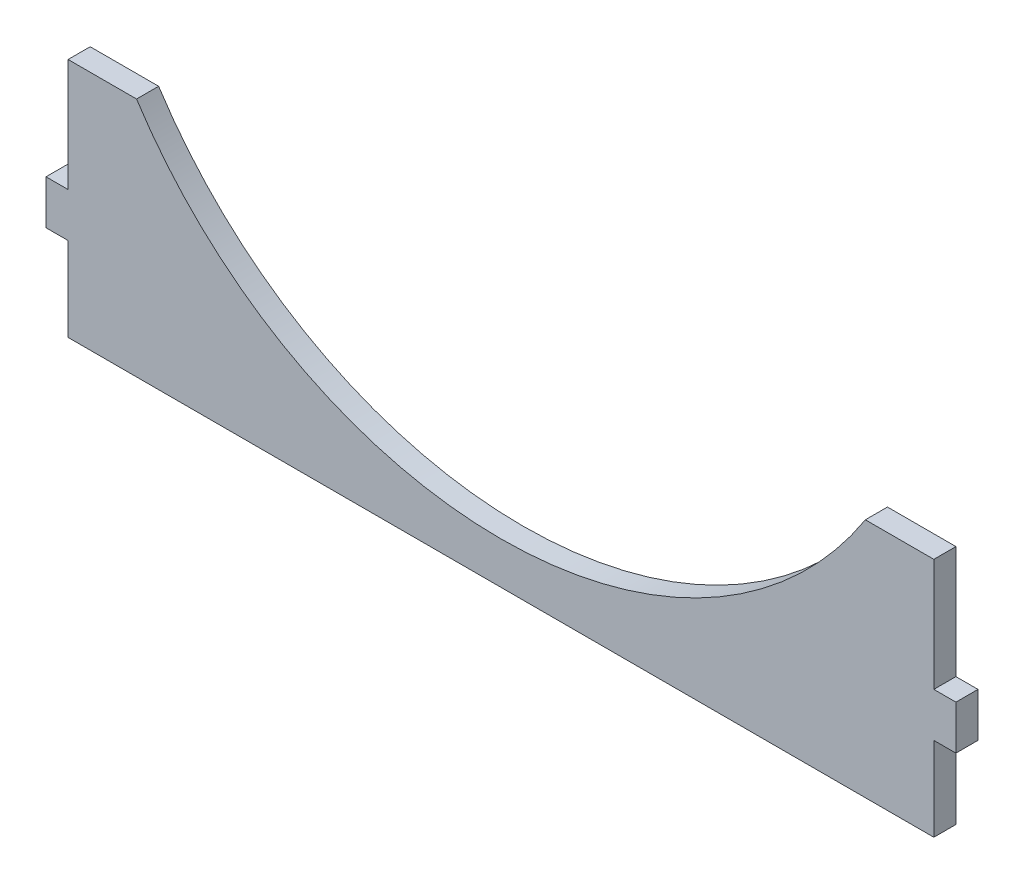
ISO-10303-21;
HEADER;
FILE_DESCRIPTION(('STEP AP214'),'2;1');
FILE_NAME('part.step','',(''),(''),'','','');
FILE_SCHEMA(('AUTOMOTIVE_DESIGN { 1 0 10303 214 1 1 1 1 }'));
ENDSEC;
DATA;
#1=APPLICATION_CONTEXT('core data for automotive mechanical design processes');
#2=APPLICATION_PROTOCOL_DEFINITION('international standard','automotive_design',2000,#1);
#3=PRODUCT_CONTEXT('',#1,'mechanical');
#4=PRODUCT('Part','Part','',(#3));
#5=PRODUCT_RELATED_PRODUCT_CATEGORY('part','',(#4));
#6=PRODUCT_DEFINITION_FORMATION('','',#4);
#7=PRODUCT_DEFINITION_CONTEXT('part definition',#1,'design');
#8=PRODUCT_DEFINITION('design','',#6,#7);
#9=PRODUCT_DEFINITION_SHAPE('','',#8);
#10=(LENGTH_UNIT() NAMED_UNIT(*) SI_UNIT(.MILLI.,.METRE.));
#11=(NAMED_UNIT(*) PLANE_ANGLE_UNIT() SI_UNIT($,.RADIAN.));
#12=(NAMED_UNIT(*) SI_UNIT($,.STERADIAN.) SOLID_ANGLE_UNIT());
#13=UNCERTAINTY_MEASURE_WITH_UNIT(LENGTH_MEASURE(1.E-05),#10,'distance_accuracy_value','');
#14=(GEOMETRIC_REPRESENTATION_CONTEXT(3) GLOBAL_UNCERTAINTY_ASSIGNED_CONTEXT((#13)) GLOBAL_UNIT_ASSIGNED_CONTEXT((#10,
#11,#12)) REPRESENTATION_CONTEXT('',''));
#15=CARTESIAN_POINT('',(0.,0.,0.));
#16=DIRECTION('',(0.,0.,1.));
#17=DIRECTION('',(1.,0.,0.));
#18=AXIS2_PLACEMENT_3D('',#15,#16,#17);
#19=CARTESIAN_POINT('',(82.5,53.125,5.));
#20=DIRECTION('',(0.,0.,-1.));
#21=DIRECTION('',(-1.,0.,0.));
#22=AXIS2_PLACEMENT_3D('',#19,#20,#21);
#23=CYLINDRICAL_SURFACE('',#22,98.125);
#24=CARTESIAN_POINT('',(82.5,53.125,0.));
#25=DIRECTION('',(0.,0.,-1.));
#26=DIRECTION('',(-1.,0.,0.));
#27=AXIS2_PLACEMENT_3D('',#24,#25,#26);
#28=CIRCLE('',#27,98.125);
#29=CARTESIAN_POINT('',(165.,0.,0.));
#30=VERTEX_POINT('',#29);
#31=CARTESIAN_POINT('',(0.,0.,0.));
#32=VERTEX_POINT('',#31);
#33=EDGE_CURVE('E177',#30,#32,#28,.T.);
#34=ORIENTED_EDGE('',*,*,#33,.T.);
#35=DIRECTION('',(0.,0.,-1.));
#36=VECTOR('',#35,1.);
#37=CARTESIAN_POINT('',(0.,0.,5.));
#38=LINE('',#37,#36);
#39=CARTESIAN_POINT('',(0.,0.,5.));
#40=VERTEX_POINT('',#39);
#41=EDGE_CURVE('E11',#40,#32,#38,.T.);
#42=ORIENTED_EDGE('',*,*,#41,.F.);
#43=CARTESIAN_POINT('',(82.5,53.125,5.));
#44=DIRECTION('',(0.,0.,-1.));
#45=DIRECTION('',(-1.,0.,0.));
#46=AXIS2_PLACEMENT_3D('',#43,#44,#45);
#47=CIRCLE('',#46,98.125);
#48=CARTESIAN_POINT('',(165.,0.,5.));
#49=VERTEX_POINT('',#48);
#50=EDGE_CURVE('E217',#49,#40,#47,.T.);
#51=ORIENTED_EDGE('',*,*,#50,.F.);
#52=DIRECTION('',(0.,0.,-1.));
#53=VECTOR('',#52,1.);
#54=CARTESIAN_POINT('',(165.,0.,5.));
#55=LINE('',#54,#53);
#56=EDGE_CURVE('E173',#49,#30,#55,.T.);
#57=ORIENTED_EDGE('',*,*,#56,.T.);
#58=EDGE_LOOP('',(#34,#42,#51,#57));
#59=FACE_BOUND('',#58,.T.);
#60=ADVANCED_FACE('F39',(#59),#23,.F.);
#61=CARTESIAN_POINT('',(0.,0.,5.));
#62=DIRECTION('',(0.,-1.,0.));
#63=DIRECTION('',(0.,0.,-1.));
#64=AXIS2_PLACEMENT_3D('',#61,#62,#63);
#65=PLANE('',#64);
#66=DIRECTION('',(-1.,0.,0.));
#67=VECTOR('',#66,1.);
#68=CARTESIAN_POINT('',(0.,0.,0.));
#69=LINE('',#68,#67);
#70=CARTESIAN_POINT('',(-15.5,0.,0.));
#71=VERTEX_POINT('',#70);
#72=EDGE_CURVE('E181',#32,#71,#69,.T.);
#73=ORIENTED_EDGE('',*,*,#72,.T.);
#74=DIRECTION('',(0.,0.,-1.));
#75=VECTOR('',#74,1.);
#76=CARTESIAN_POINT('',(-15.5,0.,5.));
#77=LINE('',#76,#75);
#78=CARTESIAN_POINT('',(-15.5,0.,5.));
#79=VERTEX_POINT('',#78);
#80=EDGE_CURVE('E48',#79,#71,#77,.T.);
#81=ORIENTED_EDGE('',*,*,#80,.F.);
#82=DIRECTION('',(-1.,0.,0.));
#83=VECTOR('',#82,1.);
#84=CARTESIAN_POINT('',(0.,0.,5.));
#85=LINE('',#84,#83);
#86=EDGE_CURVE('E117',#40,#79,#85,.T.);
#87=ORIENTED_EDGE('',*,*,#86,.F.);
#88=ORIENTED_EDGE('',*,*,#41,.T.);
#89=EDGE_LOOP('',(#73,#81,#87,#88));
#90=FACE_BOUND('',#89,.T.);
#91=ADVANCED_FACE('F361',(#90),#65,.F.);
#92=CARTESIAN_POINT('',(-15.5,0.,5.));
#93=DIRECTION('',(1.,0.,0.));
#94=DIRECTION('',(0.,1.,0.));
#95=AXIS2_PLACEMENT_3D('',#92,#93,#94);
#96=PLANE('',#95);
#97=DIRECTION('',(0.,-1.,0.));
#98=VECTOR('',#97,1.);
#99=CARTESIAN_POINT('',(-15.5,0.,0.));
#100=LINE('',#99,#98);
#101=CARTESIAN_POINT('',(-15.5,-25.5,0.));
#102=VERTEX_POINT('',#101);
#103=EDGE_CURVE('E184',#71,#102,#100,.T.);
#104=ORIENTED_EDGE('',*,*,#103,.T.);
#105=DIRECTION('',(0.,0.,-1.));
#106=VECTOR('',#105,1.);
#107=CARTESIAN_POINT('',(-15.5,-25.5,5.));
#108=LINE('',#107,#106);
#109=CARTESIAN_POINT('',(-15.5,-25.5,5.));
#110=VERTEX_POINT('',#109);
#111=EDGE_CURVE('E252',#110,#102,#108,.T.);
#112=ORIENTED_EDGE('',*,*,#111,.F.);
#113=DIRECTION('',(0.,-1.,0.));
#114=VECTOR('',#113,1.);
#115=CARTESIAN_POINT('',(-15.5,0.,5.));
#116=LINE('',#115,#114);
#117=EDGE_CURVE('E263',#79,#110,#116,.T.);
#118=ORIENTED_EDGE('',*,*,#117,.F.);
#119=ORIENTED_EDGE('',*,*,#80,.T.);
#120=EDGE_LOOP('',(#104,#112,#118,#119));
#121=FACE_BOUND('',#120,.T.);
#122=ADVANCED_FACE('F261',(#121),#96,.F.);
#123=CARTESIAN_POINT('',(-15.5,-25.5,5.));
#124=DIRECTION('',(0.,-1.,0.));
#125=DIRECTION('',(0.,0.,-1.));
#126=AXIS2_PLACEMENT_3D('',#123,#124,#125);
#127=PLANE('',#126);
#128=DIRECTION('',(-1.,0.,0.));
#129=VECTOR('',#128,1.);
#130=CARTESIAN_POINT('',(-15.5,-25.5,0.));
#131=LINE('',#130,#129);
#132=CARTESIAN_POINT('',(-20.5,-25.5,0.));
#133=VERTEX_POINT('',#132);
#134=EDGE_CURVE('E187',#102,#133,#131,.T.);
#135=ORIENTED_EDGE('',*,*,#134,.T.);
#136=DIRECTION('',(0.,0.,-1.));
#137=VECTOR('',#136,1.);
#138=CARTESIAN_POINT('',(-20.5,-25.5,5.));
#139=LINE('',#138,#137);
#140=CARTESIAN_POINT('',(-20.5,-25.5,5.));
#141=VERTEX_POINT('',#140);
#142=EDGE_CURVE('E248',#141,#133,#139,.T.);
#143=ORIENTED_EDGE('',*,*,#142,.F.);
#144=DIRECTION('',(-1.,0.,0.));
#145=VECTOR('',#144,1.);
#146=CARTESIAN_POINT('',(-15.5,-25.5,5.));
#147=LINE('',#146,#145);
#148=EDGE_CURVE('E282',#110,#141,#147,.T.);
#149=ORIENTED_EDGE('',*,*,#148,.F.);
#150=ORIENTED_EDGE('',*,*,#111,.T.);
#151=EDGE_LOOP('',(#135,#143,#149,#150));
#152=FACE_BOUND('',#151,.T.);
#153=ADVANCED_FACE('F272',(#152),#127,.F.);
#154=CARTESIAN_POINT('',(-20.5,-25.5,5.));
#155=DIRECTION('',(1.,0.,0.));
#156=DIRECTION('',(0.,1.,0.));
#157=AXIS2_PLACEMENT_3D('',#154,#155,#156);
#158=PLANE('',#157);
#159=DIRECTION('',(0.,-1.,0.));
#160=VECTOR('',#159,1.);
#161=CARTESIAN_POINT('',(-20.5,-25.5,0.));
#162=LINE('',#161,#160);
#163=CARTESIAN_POINT('',(-20.5,-35.5,0.));
#164=VERTEX_POINT('',#163);
#165=EDGE_CURVE('E190',#133,#164,#162,.T.);
#166=ORIENTED_EDGE('',*,*,#165,.T.);
#167=DIRECTION('',(0.,0.,-1.));
#168=VECTOR('',#167,1.);
#169=CARTESIAN_POINT('',(-20.5,-35.5,5.));
#170=LINE('',#169,#168);
#171=CARTESIAN_POINT('',(-20.5,-35.5,5.));
#172=VERTEX_POINT('',#171);
#173=EDGE_CURVE('E244',#172,#164,#170,.T.);
#174=ORIENTED_EDGE('',*,*,#173,.F.);
#175=DIRECTION('',(0.,-1.,0.));
#176=VECTOR('',#175,1.);
#177=CARTESIAN_POINT('',(-20.5,-25.5,5.));
#178=LINE('',#177,#176);
#179=EDGE_CURVE('E278',#141,#172,#178,.T.);
#180=ORIENTED_EDGE('',*,*,#179,.F.);
#181=ORIENTED_EDGE('',*,*,#142,.T.);
#182=EDGE_LOOP('',(#166,#174,#180,#181));
#183=FACE_BOUND('',#182,.T.);
#184=ADVANCED_FACE('F276',(#183),#158,.F.);
#185=CARTESIAN_POINT('',(-20.5,-35.5,5.));
#186=DIRECTION('',(0.,1.,0.));
#187=DIRECTION('',(0.,0.,1.));
#188=AXIS2_PLACEMENT_3D('',#185,#186,#187);
#189=PLANE('',#188);
#190=DIRECTION('',(1.,0.,0.));
#191=VECTOR('',#190,1.);
#192=CARTESIAN_POINT('',(-20.5,-35.5,0.));
#193=LINE('',#192,#191);
#194=CARTESIAN_POINT('',(-15.5,-35.5,0.));
#195=VERTEX_POINT('',#194);
#196=EDGE_CURVE('E193',#164,#195,#193,.T.);
#197=ORIENTED_EDGE('',*,*,#196,.T.);
#198=DIRECTION('',(0.,0.,-1.));
#199=VECTOR('',#198,1.);
#200=CARTESIAN_POINT('',(-15.5,-35.5,5.));
#201=LINE('',#200,#199);
#202=CARTESIAN_POINT('',(-15.5,-35.5,5.));
#203=VERTEX_POINT('',#202);
#204=EDGE_CURVE('E240',#203,#195,#201,.T.);
#205=ORIENTED_EDGE('',*,*,#204,.F.);
#206=DIRECTION('',(1.,0.,0.));
#207=VECTOR('',#206,1.);
#208=CARTESIAN_POINT('',(-20.5,-35.5,5.));
#209=LINE('',#208,#207);
#210=EDGE_CURVE('E281',#172,#203,#209,.T.);
#211=ORIENTED_EDGE('',*,*,#210,.F.);
#212=ORIENTED_EDGE('',*,*,#173,.T.);
#213=EDGE_LOOP('',(#197,#205,#211,#212));
#214=FACE_BOUND('',#213,.T.);
#215=ADVANCED_FACE('F373',(#214),#189,.F.);
#216=CARTESIAN_POINT('',(-15.5,-35.5,5.));
#217=DIRECTION('',(1.,0.,0.));
#218=DIRECTION('',(0.,1.,0.));
#219=AXIS2_PLACEMENT_3D('',#216,#217,#218);
#220=PLANE('',#219);
#221=DIRECTION('',(0.,-1.,0.));
#222=VECTOR('',#221,1.);
#223=CARTESIAN_POINT('',(-15.5,-35.5,0.));
#224=LINE('',#223,#222);
#225=CARTESIAN_POINT('',(-15.5,-54.5,0.));
#226=VERTEX_POINT('',#225);
#227=EDGE_CURVE('E196',#195,#226,#224,.T.);
#228=ORIENTED_EDGE('',*,*,#227,.T.);
#229=DIRECTION('',(0.,0.,-1.));
#230=VECTOR('',#229,1.);
#231=CARTESIAN_POINT('',(-15.5,-54.5,5.));
#232=LINE('',#231,#230);
#233=CARTESIAN_POINT('',(-15.5,-54.5,5.));
#234=VERTEX_POINT('',#233);
#235=EDGE_CURVE('E236',#234,#226,#232,.T.);
#236=ORIENTED_EDGE('',*,*,#235,.F.);
#237=DIRECTION('',(0.,-1.,0.));
#238=VECTOR('',#237,1.);
#239=CARTESIAN_POINT('',(-15.5,-35.5,5.));
#240=LINE('',#239,#238);
#241=EDGE_CURVE('E287',#203,#234,#240,.T.);
#242=ORIENTED_EDGE('',*,*,#241,.F.);
#243=ORIENTED_EDGE('',*,*,#204,.T.);
#244=EDGE_LOOP('',(#228,#236,#242,#243));
#245=FACE_BOUND('',#244,.T.);
#246=ADVANCED_FACE('F376',(#245),#220,.F.);
#247=CARTESIAN_POINT('',(-15.5,-54.5,5.));
#248=DIRECTION('',(0.,1.,0.));
#249=DIRECTION('',(-1.,0.,0.));
#250=AXIS2_PLACEMENT_3D('',#247,#248,#249);
#251=PLANE('',#250);
#252=DIRECTION('',(1.,0.,0.));
#253=VECTOR('',#252,1.);
#254=CARTESIAN_POINT('',(-15.5,-54.5,0.));
#255=LINE('',#254,#253);
#256=CARTESIAN_POINT('',(180.5,-54.4999999999999,0.));
#257=VERTEX_POINT('',#256);
#258=EDGE_CURVE('E199',#226,#257,#255,.T.);
#259=ORIENTED_EDGE('',*,*,#258,.T.);
#260=DIRECTION('',(0.,0.,-1.));
#261=VECTOR('',#260,1.);
#262=CARTESIAN_POINT('',(180.5,-54.4999999999999,5.));
#263=LINE('',#262,#261);
#264=CARTESIAN_POINT('',(180.5,-54.4999999999999,5.));
#265=VERTEX_POINT('',#264);
#266=EDGE_CURVE('E232',#265,#257,#263,.T.);
#267=ORIENTED_EDGE('',*,*,#266,.F.);
#268=DIRECTION('',(1.,0.,0.));
#269=VECTOR('',#268,1.);
#270=CARTESIAN_POINT('',(-15.5,-54.5,5.));
#271=LINE('',#270,#269);
#272=EDGE_CURVE('E294',#234,#265,#271,.T.);
#273=ORIENTED_EDGE('',*,*,#272,.F.);
#274=ORIENTED_EDGE('',*,*,#235,.T.);
#275=EDGE_LOOP('',(#259,#267,#273,#274));
#276=FACE_BOUND('',#275,.T.);
#277=ADVANCED_FACE('F380',(#276),#251,.F.);
#278=CARTESIAN_POINT('',(180.5,-54.4999999999999,5.));
#279=DIRECTION('',(-1.,0.,0.));
#280=DIRECTION('',(0.,-1.,0.));
#281=AXIS2_PLACEMENT_3D('',#278,#279,#280);
#282=PLANE('',#281);
#283=DIRECTION('',(0.,1.,0.));
#284=VECTOR('',#283,1.);
#285=CARTESIAN_POINT('',(180.5,-54.4999999999999,0.));
#286=LINE('',#285,#284);
#287=CARTESIAN_POINT('',(180.5,-35.4999999999999,0.));
#288=VERTEX_POINT('',#287);
#289=EDGE_CURVE('E202',#257,#288,#286,.T.);
#290=ORIENTED_EDGE('',*,*,#289,.T.);
#291=DIRECTION('',(0.,0.,-1.));
#292=VECTOR('',#291,1.);
#293=CARTESIAN_POINT('',(180.5,-35.4999999999999,5.));
#294=LINE('',#293,#292);
#295=CARTESIAN_POINT('',(180.5,-35.4999999999999,5.));
#296=VERTEX_POINT('',#295);
#297=EDGE_CURVE('E228',#296,#288,#294,.T.);
#298=ORIENTED_EDGE('',*,*,#297,.F.);
#299=DIRECTION('',(0.,1.,0.));
#300=VECTOR('',#299,1.);
#301=CARTESIAN_POINT('',(180.5,-54.4999999999999,5.));
#302=LINE('',#301,#300);
#303=EDGE_CURVE('E297',#265,#296,#302,.T.);
#304=ORIENTED_EDGE('',*,*,#303,.F.);
#305=ORIENTED_EDGE('',*,*,#266,.T.);
#306=EDGE_LOOP('',(#290,#298,#304,#305));
#307=FACE_BOUND('',#306,.T.);
#308=ADVANCED_FACE('F384',(#307),#282,.F.);
#309=CARTESIAN_POINT('',(180.5,-35.4999999999999,5.));
#310=DIRECTION('',(0.,1.,0.));
#311=DIRECTION('',(0.,0.,1.));
#312=AXIS2_PLACEMENT_3D('',#309,#310,#311);
#313=PLANE('',#312);
#314=DIRECTION('',(1.,0.,0.));
#315=VECTOR('',#314,1.);
#316=CARTESIAN_POINT('',(180.5,-35.4999999999999,0.));
#317=LINE('',#316,#315);
#318=CARTESIAN_POINT('',(185.5,-35.4999999999999,0.));
#319=VERTEX_POINT('',#318);
#320=EDGE_CURVE('E205',#288,#319,#317,.T.);
#321=ORIENTED_EDGE('',*,*,#320,.T.);
#322=DIRECTION('',(0.,0.,-1.));
#323=VECTOR('',#322,1.);
#324=CARTESIAN_POINT('',(185.5,-35.4999999999999,5.));
#325=LINE('',#324,#323);
#326=CARTESIAN_POINT('',(185.5,-35.4999999999999,5.));
#327=VERTEX_POINT('',#326);
#328=EDGE_CURVE('E224',#327,#319,#325,.T.);
#329=ORIENTED_EDGE('',*,*,#328,.F.);
#330=DIRECTION('',(1.,0.,0.));
#331=VECTOR('',#330,1.);
#332=CARTESIAN_POINT('',(180.5,-35.4999999999999,5.));
#333=LINE('',#332,#331);
#334=EDGE_CURVE('E300',#296,#327,#333,.T.);
#335=ORIENTED_EDGE('',*,*,#334,.F.);
#336=ORIENTED_EDGE('',*,*,#297,.T.);
#337=EDGE_LOOP('',(#321,#329,#335,#336));
#338=FACE_BOUND('',#337,.T.);
#339=ADVANCED_FACE('F388',(#338),#313,.F.);
#340=CARTESIAN_POINT('',(185.5,-35.4999999999999,5.));
#341=DIRECTION('',(-1.,0.,0.));
#342=DIRECTION('',(0.,0.,1.));
#343=AXIS2_PLACEMENT_3D('',#340,#341,#342);
#344=PLANE('',#343);
#345=DIRECTION('',(0.,1.,0.));
#346=VECTOR('',#345,1.);
#347=CARTESIAN_POINT('',(185.5,-35.4999999999999,0.));
#348=LINE('',#347,#346);
#349=CARTESIAN_POINT('',(185.5,-25.4999999999999,0.));
#350=VERTEX_POINT('',#349);
#351=EDGE_CURVE('E208',#319,#350,#348,.T.);
#352=ORIENTED_EDGE('',*,*,#351,.T.);
#353=DIRECTION('',(0.,0.,-1.));
#354=VECTOR('',#353,1.);
#355=CARTESIAN_POINT('',(185.5,-25.4999999999999,5.));
#356=LINE('',#355,#354);
#357=CARTESIAN_POINT('',(185.5,-25.4999999999999,5.));
#358=VERTEX_POINT('',#357);
#359=EDGE_CURVE('E165',#358,#350,#356,.T.);
#360=ORIENTED_EDGE('',*,*,#359,.F.);
#361=DIRECTION('',(0.,1.,0.));
#362=VECTOR('',#361,1.);
#363=CARTESIAN_POINT('',(185.5,-35.4999999999999,5.));
#364=LINE('',#363,#362);
#365=EDGE_CURVE('E154',#327,#358,#364,.T.);
#366=ORIENTED_EDGE('',*,*,#365,.F.);
#367=ORIENTED_EDGE('',*,*,#328,.T.);
#368=EDGE_LOOP('',(#352,#360,#366,#367));
#369=FACE_BOUND('',#368,.T.);
#370=ADVANCED_FACE('F392',(#369),#344,.F.);
#371=CARTESIAN_POINT('',(185.5,-25.4999999999999,5.));
#372=DIRECTION('',(0.,-1.,0.));
#373=DIRECTION('',(1.,0.,0.));
#374=AXIS2_PLACEMENT_3D('',#371,#372,#373);
#375=PLANE('',#374);
#376=DIRECTION('',(-1.,0.,0.));
#377=VECTOR('',#376,1.);
#378=CARTESIAN_POINT('',(185.5,-25.4999999999999,0.));
#379=LINE('',#378,#377);
#380=CARTESIAN_POINT('',(180.5,-25.4999999999999,0.));
#381=VERTEX_POINT('',#380);
#382=EDGE_CURVE('E163',#350,#381,#379,.T.);
#383=ORIENTED_EDGE('',*,*,#382,.T.);
#384=DIRECTION('',(0.,0.,-1.));
#385=VECTOR('',#384,1.);
#386=CARTESIAN_POINT('',(180.5,-25.4999999999999,5.));
#387=LINE('',#386,#385);
#388=CARTESIAN_POINT('',(180.5,-25.4999999999999,5.));
#389=VERTEX_POINT('',#388);
#390=EDGE_CURVE('E160',#389,#381,#387,.T.);
#391=ORIENTED_EDGE('',*,*,#390,.F.);
#392=DIRECTION('',(-1.,0.,0.));
#393=VECTOR('',#392,1.);
#394=CARTESIAN_POINT('',(185.5,-25.4999999999999,5.));
#395=LINE('',#394,#393);
#396=EDGE_CURVE('E148',#358,#389,#395,.T.);
#397=ORIENTED_EDGE('',*,*,#396,.F.);
#398=ORIENTED_EDGE('',*,*,#359,.T.);
#399=EDGE_LOOP('',(#383,#391,#397,#398));
#400=FACE_BOUND('',#399,.T.);
#401=ADVANCED_FACE('F161',(#400),#375,.F.);
#402=CARTESIAN_POINT('',(180.5,-25.4999999999999,5.));
#403=DIRECTION('',(-1.,0.,0.));
#404=DIRECTION('',(0.,-1.,0.));
#405=AXIS2_PLACEMENT_3D('',#402,#403,#404);
#406=PLANE('',#405);
#407=DIRECTION('',(0.,1.,0.));
#408=VECTOR('',#407,1.);
#409=CARTESIAN_POINT('',(180.5,-25.4999999999999,0.));
#410=LINE('',#409,#408);
#411=CARTESIAN_POINT('',(180.5,0.,0.));
#412=VERTEX_POINT('',#411);
#413=EDGE_CURVE('E103',#381,#412,#410,.T.);
#414=ORIENTED_EDGE('',*,*,#413,.T.);
#415=DIRECTION('',(0.,0.,-1.));
#416=VECTOR('',#415,1.);
#417=CARTESIAN_POINT('',(180.5,0.,5.));
#418=LINE('',#417,#416);
#419=CARTESIAN_POINT('',(180.5,0.,5.));
#420=VERTEX_POINT('',#419);
#421=EDGE_CURVE('E166',#420,#412,#418,.T.);
#422=ORIENTED_EDGE('',*,*,#421,.F.);
#423=DIRECTION('',(0.,1.,0.));
#424=VECTOR('',#423,1.);
#425=CARTESIAN_POINT('',(180.5,-25.4999999999999,5.));
#426=LINE('',#425,#424);
#427=EDGE_CURVE('E152',#389,#420,#426,.T.);
#428=ORIENTED_EDGE('',*,*,#427,.F.);
#429=ORIENTED_EDGE('',*,*,#390,.T.);
#430=EDGE_LOOP('',(#414,#422,#428,#429));
#431=FACE_BOUND('',#430,.T.);
#432=ADVANCED_FACE('F168',(#431),#406,.F.);
#433=CARTESIAN_POINT('',(180.5,0.,5.));
#434=DIRECTION('',(0.,-1.,0.));
#435=DIRECTION('',(1.,0.,0.));
#436=AXIS2_PLACEMENT_3D('',#433,#434,#435);
#437=PLANE('',#436);
#438=DIRECTION('',(-1.,0.,0.));
#439=VECTOR('',#438,1.);
#440=CARTESIAN_POINT('',(180.5,0.,0.));
#441=LINE('',#440,#439);
#442=EDGE_CURVE('E109',#412,#30,#441,.T.);
#443=ORIENTED_EDGE('',*,*,#442,.T.);
#444=ORIENTED_EDGE('',*,*,#56,.F.);
#445=DIRECTION('',(-1.,0.,0.));
#446=VECTOR('',#445,1.);
#447=CARTESIAN_POINT('',(180.5,0.,5.));
#448=LINE('',#447,#446);
#449=EDGE_CURVE('E56',#420,#49,#448,.T.);
#450=ORIENTED_EDGE('',*,*,#449,.F.);
#451=ORIENTED_EDGE('',*,*,#421,.T.);
#452=EDGE_LOOP('',(#443,#444,#450,#451));
#453=FACE_BOUND('',#452,.T.);
#454=ADVANCED_FACE('F401',(#453),#437,.F.);
#455=CARTESIAN_POINT('',(82.5,53.125,5.));
#456=DIRECTION('',(0.,0.,-1.));
#457=DIRECTION('',(-1.,0.,0.));
#458=AXIS2_PLACEMENT_3D('',#455,#456,#457);
#459=PLANE('',#458);
#460=ORIENTED_EDGE('',*,*,#50,.T.);
#461=ORIENTED_EDGE('',*,*,#86,.T.);
#462=ORIENTED_EDGE('',*,*,#117,.T.);
#463=ORIENTED_EDGE('',*,*,#148,.T.);
#464=ORIENTED_EDGE('',*,*,#179,.T.);
#465=ORIENTED_EDGE('',*,*,#210,.T.);
#466=ORIENTED_EDGE('',*,*,#241,.T.);
#467=ORIENTED_EDGE('',*,*,#272,.T.);
#468=ORIENTED_EDGE('',*,*,#303,.T.);
#469=ORIENTED_EDGE('',*,*,#334,.T.);
#470=ORIENTED_EDGE('',*,*,#365,.T.);
#471=ORIENTED_EDGE('',*,*,#396,.T.);
#472=ORIENTED_EDGE('',*,*,#427,.T.);
#473=ORIENTED_EDGE('',*,*,#449,.T.);
#474=EDGE_LOOP('',(#460,#461,#462,#463,#464,#465,#466,#467,#468,#469,#470,#471,#472,#473));
#475=FACE_BOUND('',#474,.T.);
#476=ADVANCED_FACE('F150',(#475),#459,.F.);
#477=CARTESIAN_POINT('',(82.5,53.125,0.));
#478=DIRECTION('',(0.,0.,-1.));
#479=DIRECTION('',(-1.,0.,0.));
#480=AXIS2_PLACEMENT_3D('',#477,#478,#479);
#481=PLANE('',#480);
#482=ORIENTED_EDGE('',*,*,#33,.F.);
#483=ORIENTED_EDGE('',*,*,#442,.F.);
#484=ORIENTED_EDGE('',*,*,#413,.F.);
#485=ORIENTED_EDGE('',*,*,#382,.F.);
#486=ORIENTED_EDGE('',*,*,#351,.F.);
#487=ORIENTED_EDGE('',*,*,#320,.F.);
#488=ORIENTED_EDGE('',*,*,#289,.F.);
#489=ORIENTED_EDGE('',*,*,#258,.F.);
#490=ORIENTED_EDGE('',*,*,#227,.F.);
#491=ORIENTED_EDGE('',*,*,#196,.F.);
#492=ORIENTED_EDGE('',*,*,#165,.F.);
#493=ORIENTED_EDGE('',*,*,#134,.F.);
#494=ORIENTED_EDGE('',*,*,#103,.F.);
#495=ORIENTED_EDGE('',*,*,#72,.F.);
#496=EDGE_LOOP('',(#482,#483,#484,#485,#486,#487,#488,#489,#490,#491,#492,#493,#494,#495));
#497=FACE_BOUND('',#496,.T.);
#498=ADVANCED_FACE('F267',(#497),#481,.T.);
#499=CLOSED_SHELL('',(#60,#91,#122,#153,#184,#215,#246,#277,#308,#339,#370,#401,#432,#454,#476,#498));
#500=MANIFOLD_SOLID_BREP('B2',#499);
#501=ADVANCED_BREP_SHAPE_REPRESENTATION('',(#18,#500),#14);
#502=SHAPE_DEFINITION_REPRESENTATION(#9,#501);
ENDSEC;
END-ISO-10303-21;
